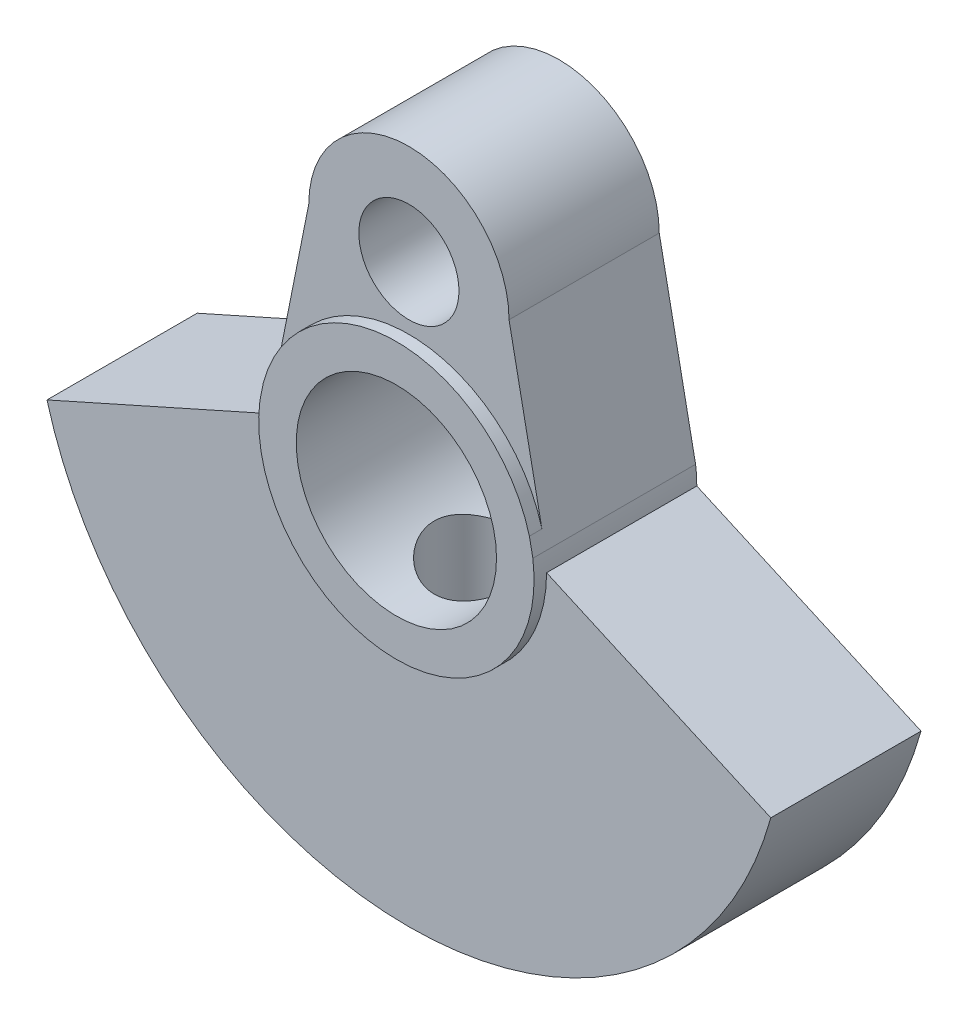
ISO-10303-21;
HEADER;
FILE_DESCRIPTION(('STEP AP214'),'2;1');
FILE_NAME('part.step','',(''),(''),'','','');
FILE_SCHEMA(('AUTOMOTIVE_DESIGN { 1 0 10303 214 1 1 1 1 }'));
ENDSEC;
DATA;
#1=APPLICATION_CONTEXT('core data for automotive mechanical design processes');
#2=APPLICATION_PROTOCOL_DEFINITION('international standard','automotive_design',2000,#1);
#3=PRODUCT_CONTEXT('',#1,'mechanical');
#4=PRODUCT('Part','Part','',(#3));
#5=PRODUCT_RELATED_PRODUCT_CATEGORY('part','',(#4));
#6=PRODUCT_DEFINITION_FORMATION('','',#4);
#7=PRODUCT_DEFINITION_CONTEXT('part definition',#1,'design');
#8=PRODUCT_DEFINITION('design','',#6,#7);
#9=PRODUCT_DEFINITION_SHAPE('','',#8);
#10=(LENGTH_UNIT() NAMED_UNIT(*) SI_UNIT(.MILLI.,.METRE.));
#11=(NAMED_UNIT(*) PLANE_ANGLE_UNIT() SI_UNIT($,.RADIAN.));
#12=(NAMED_UNIT(*) SI_UNIT($,.STERADIAN.) SOLID_ANGLE_UNIT());
#13=UNCERTAINTY_MEASURE_WITH_UNIT(LENGTH_MEASURE(1.E-05),#10,'distance_accuracy_value','');
#14=(GEOMETRIC_REPRESENTATION_CONTEXT(3) GLOBAL_UNCERTAINTY_ASSIGNED_CONTEXT((#13)) GLOBAL_UNIT_ASSIGNED_CONTEXT((#10,
#11,#12)) REPRESENTATION_CONTEXT('',''));
#15=CARTESIAN_POINT('',(0.,0.,0.));
#16=DIRECTION('',(0.,0.,1.));
#17=DIRECTION('',(1.,0.,0.));
#18=AXIS2_PLACEMENT_3D('',#15,#16,#17);
#19=CARTESIAN_POINT('',(-5.38239879261477,1.07435846219703,3.));
#20=DIRECTION('',(0.980654930855413,-0.195744493125514,0.));
#21=DIRECTION('',(0.195744493125514,0.980654930855413,0.));
#22=AXIS2_PLACEMENT_3D('',#19,#20,#21);
#23=PLANE('',#22);
#24=DIRECTION('',(-0.195744493125514,-0.980654930855414,0.));
#25=VECTOR('',#24,1.);
#26=CARTESIAN_POINT('',(-5.38239879261477,1.07435846219703,-3.));
#27=LINE('',#26,#25);
#28=CARTESIAN_POINT('',(-4.,8.,-3.));
#29=VERTEX_POINT('',#28);
#30=CARTESIAN_POINT('',(-5.45175345375449,0.726900460500602,-3.));
#31=VERTEX_POINT('',#30);
#32=EDGE_CURVE('E242',#29,#31,#27,.T.);
#33=ORIENTED_EDGE('',*,*,#32,.T.);
#34=DIRECTION('',(0.,0.,-1.));
#35=VECTOR('',#34,1.);
#36=CARTESIAN_POINT('',(-5.45175345375449,0.726900460500602,3.5));
#37=LINE('',#36,#35);
#38=CARTESIAN_POINT('',(-5.45175345375449,0.726900460500602,3.5));
#39=VERTEX_POINT('',#38);
#40=EDGE_CURVE('E213',#39,#31,#37,.T.);
#41=ORIENTED_EDGE('',*,*,#40,.F.);
#42=DIRECTION('',(-0.195744493125514,-0.980654930855414,0.));
#43=VECTOR('',#42,1.);
#44=CARTESIAN_POINT('',(-5.38239879261477,1.07435846219703,3.5));
#45=LINE('',#44,#43);
#46=CARTESIAN_POINT('',(-5.31304413147506,1.42181646389345,3.5));
#47=VERTEX_POINT('',#46);
#48=EDGE_CURVE('E196',#47,#39,#45,.T.);
#49=ORIENTED_EDGE('',*,*,#48,.F.);
#50=DIRECTION('',(0.,0.,-1.));
#51=VECTOR('',#50,1.);
#52=CARTESIAN_POINT('',(-5.31304413147506,1.42181646389345,3.5));
#53=LINE('',#52,#51);
#54=CARTESIAN_POINT('',(-5.31304413147506,1.42181646389345,3.));
#55=VERTEX_POINT('',#54);
#56=EDGE_CURVE('E209',#47,#55,#53,.T.);
#57=ORIENTED_EDGE('',*,*,#56,.T.);
#58=DIRECTION('',(-0.195744493125514,-0.980654930855414,0.));
#59=VECTOR('',#58,1.);
#60=CARTESIAN_POINT('',(-5.38239879261477,1.07435846219703,3.));
#61=LINE('',#60,#59);
#62=CARTESIAN_POINT('',(-4.,8.,3.));
#63=VERTEX_POINT('',#62);
#64=EDGE_CURVE('E224',#63,#55,#61,.T.);
#65=ORIENTED_EDGE('',*,*,#64,.F.);
#66=DIRECTION('',(0.,0.,-1.));
#67=VECTOR('',#66,1.);
#68=CARTESIAN_POINT('',(-4.,8.,3.));
#69=LINE('',#68,#67);
#70=EDGE_CURVE('E65',#63,#29,#69,.T.);
#71=ORIENTED_EDGE('',*,*,#70,.T.);
#72=EDGE_LOOP('',(#33,#41,#49,#57,#65,#71));
#73=FACE_BOUND('',#72,.T.);
#74=ADVANCED_FACE('F56',(#73),#23,.F.);
#75=CARTESIAN_POINT('',(5.38239879261477,1.07435846219703,3.));
#76=DIRECTION('',(0.980654930855413,0.195744493125514,0.));
#77=DIRECTION('',(-0.195744493125514,0.980654930855413,0.));
#78=AXIS2_PLACEMENT_3D('',#75,#76,#77);
#79=PLANE('',#78);
#80=DIRECTION('',(0.195744493125514,-0.980654930855414,0.));
#81=VECTOR('',#80,1.);
#82=CARTESIAN_POINT('',(5.38239879261477,1.07435846219703,-3.));
#83=LINE('',#82,#81);
#84=CARTESIAN_POINT('',(4.,8.,-3.));
#85=VERTEX_POINT('',#84);
#86=CARTESIAN_POINT('',(5.45175345375449,0.726900460500602,-3.));
#87=VERTEX_POINT('',#86);
#88=EDGE_CURVE('E245',#85,#87,#83,.T.);
#89=ORIENTED_EDGE('',*,*,#88,.F.);
#90=DIRECTION('',(0.,0.,-1.));
#91=VECTOR('',#90,1.);
#92=CARTESIAN_POINT('',(4.,8.,3.));
#93=LINE('',#92,#91);
#94=CARTESIAN_POINT('',(4.,8.,3.));
#95=VERTEX_POINT('',#94);
#96=EDGE_CURVE('E12',#95,#85,#93,.T.);
#97=ORIENTED_EDGE('',*,*,#96,.F.);
#98=DIRECTION('',(0.195744493125514,-0.980654930855414,0.));
#99=VECTOR('',#98,1.);
#100=CARTESIAN_POINT('',(5.38239879261477,1.07435846219703,3.));
#101=LINE('',#100,#99);
#102=CARTESIAN_POINT('',(5.31304413147506,1.42181646389345,3.));
#103=VERTEX_POINT('',#102);
#104=EDGE_CURVE('E232',#95,#103,#101,.T.);
#105=ORIENTED_EDGE('',*,*,#104,.T.);
#106=DIRECTION('',(0.,0.,-1.));
#107=VECTOR('',#106,1.);
#108=CARTESIAN_POINT('',(5.31304413147506,1.42181646389345,3.5));
#109=LINE('',#108,#107);
#110=CARTESIAN_POINT('',(5.31304413147506,1.42181646389345,3.5));
#111=VERTEX_POINT('',#110);
#112=EDGE_CURVE('E205',#111,#103,#109,.T.);
#113=ORIENTED_EDGE('',*,*,#112,.F.);
#114=DIRECTION('',(0.195744493125514,-0.980654930855414,0.));
#115=VECTOR('',#114,1.);
#116=CARTESIAN_POINT('',(5.38239879261477,1.07435846219703,3.5));
#117=LINE('',#116,#115);
#118=CARTESIAN_POINT('',(5.45175345375449,0.726900460500602,3.5));
#119=VERTEX_POINT('',#118);
#120=EDGE_CURVE('E188',#111,#119,#117,.T.);
#121=ORIENTED_EDGE('',*,*,#120,.T.);
#122=DIRECTION('',(0.,0.,-1.));
#123=VECTOR('',#122,1.);
#124=CARTESIAN_POINT('',(5.45175345375449,0.726900460500602,3.5));
#125=LINE('',#124,#123);
#126=EDGE_CURVE('E202',#119,#87,#125,.T.);
#127=ORIENTED_EDGE('',*,*,#126,.T.);
#128=EDGE_LOOP('',(#89,#97,#105,#113,#121,#127));
#129=FACE_BOUND('',#128,.T.);
#130=ADVANCED_FACE('F282',(#129),#79,.T.);
#131=CARTESIAN_POINT('',(0.,8.,3.));
#132=DIRECTION('',(0.,0.,-1.));
#133=DIRECTION('',(-1.,0.,0.));
#134=AXIS2_PLACEMENT_3D('',#131,#132,#133);
#135=CYLINDRICAL_SURFACE('',#134,2.);
#136=CARTESIAN_POINT('',(0.,8.,3.));
#137=DIRECTION('',(0.,0.,1.));
#138=DIRECTION('',(1.,0.,0.));
#139=AXIS2_PLACEMENT_3D('',#136,#137,#138);
#140=CIRCLE('',#139,2.);
#141=CARTESIAN_POINT('',(2.,8.,3.));
#142=VERTEX_POINT('',#141);
#143=EDGE_CURVE('E220',#142,#142,#140,.T.);
#144=ORIENTED_EDGE('',*,*,#143,.T.);
#145=EDGE_LOOP('',(#144));
#146=FACE_BOUND('',#145,.T.);
#147=CARTESIAN_POINT('',(0.,8.,-3.));
#148=DIRECTION('',(0.,0.,1.));
#149=DIRECTION('',(1.,0.,0.));
#150=AXIS2_PLACEMENT_3D('',#147,#148,#149);
#151=CIRCLE('',#150,2.);
#152=CARTESIAN_POINT('',(2.,8.,-3.));
#153=VERTEX_POINT('',#152);
#154=EDGE_CURVE('E208',#153,#153,#151,.T.);
#155=ORIENTED_EDGE('',*,*,#154,.F.);
#156=EDGE_LOOP('',(#155));
#157=FACE_BOUND('',#156,.T.);
#158=ADVANCED_FACE('F58',(#146,#157),#135,.F.);
#159=CARTESIAN_POINT('',(0.,8.,3.));
#160=DIRECTION('',(0.,0.,-1.));
#161=DIRECTION('',(-1.,0.,0.));
#162=AXIS2_PLACEMENT_3D('',#159,#160,#161);
#163=CYLINDRICAL_SURFACE('',#162,4.);
#164=CARTESIAN_POINT('',(0.,8.,-3.));
#165=DIRECTION('',(0.,0.,1.));
#166=DIRECTION('',(1.,0.,0.));
#167=AXIS2_PLACEMENT_3D('',#164,#165,#166);
#168=CIRCLE('',#167,4.);
#169=EDGE_CURVE('E225',#85,#29,#168,.T.);
#170=ORIENTED_EDGE('',*,*,#169,.T.);
#171=ORIENTED_EDGE('',*,*,#70,.F.);
#172=CARTESIAN_POINT('',(0.,8.,3.));
#173=DIRECTION('',(0.,0.,1.));
#174=DIRECTION('',(1.,0.,0.));
#175=AXIS2_PLACEMENT_3D('',#172,#173,#174);
#176=CIRCLE('',#175,4.);
#177=EDGE_CURVE('E236',#95,#63,#176,.T.);
#178=ORIENTED_EDGE('',*,*,#177,.F.);
#179=ORIENTED_EDGE('',*,*,#96,.T.);
#180=EDGE_LOOP('',(#170,#171,#178,#179));
#181=FACE_BOUND('',#180,.T.);
#182=ADVANCED_FACE('F283',(#181),#163,.T.);
#183=CARTESIAN_POINT('',(0.,0.,3.));
#184=DIRECTION('',(0.,0.,1.));
#185=DIRECTION('',(1.,0.,0.));
#186=AXIS2_PLACEMENT_3D('',#183,#184,#185);
#187=PLANE('',#186);
#188=ORIENTED_EDGE('',*,*,#143,.F.);
#189=EDGE_LOOP('',(#188));
#190=FACE_BOUND('',#189,.T.);
#191=ORIENTED_EDGE('',*,*,#64,.T.);
#192=CARTESIAN_POINT('',(0.,0.,3.));
#193=DIRECTION('',(0.,0.,1.));
#194=DIRECTION('',(1.,0.,0.));
#195=AXIS2_PLACEMENT_3D('',#192,#193,#194);
#196=CIRCLE('',#195,5.5);
#197=EDGE_CURVE('E229',#103,#55,#196,.T.);
#198=ORIENTED_EDGE('',*,*,#197,.F.);
#199=ORIENTED_EDGE('',*,*,#104,.F.);
#200=ORIENTED_EDGE('',*,*,#177,.T.);
#201=EDGE_LOOP('',(#191,#198,#199,#200));
#202=FACE_BOUND('',#201,.T.);
#203=ADVANCED_FACE('F280',(#190,#202),#187,.T.);
#204=CARTESIAN_POINT('',(0.,0.,-3.));
#205=DIRECTION('',(0.,0.,1.));
#206=DIRECTION('',(1.,0.,0.));
#207=AXIS2_PLACEMENT_3D('',#204,#205,#206);
#208=PLANE('',#207);
#209=ORIENTED_EDGE('',*,*,#154,.T.);
#210=EDGE_LOOP('',(#209));
#211=FACE_BOUND('',#210,.T.);
#212=ORIENTED_EDGE('',*,*,#32,.F.);
#213=ORIENTED_EDGE('',*,*,#169,.F.);
#214=ORIENTED_EDGE('',*,*,#88,.T.);
#215=CARTESIAN_POINT('',(0.,0.,-3.));
#216=DIRECTION('',(0.,0.,1.));
#217=DIRECTION('',(1.,0.,0.));
#218=AXIS2_PLACEMENT_3D('',#215,#216,#217);
#219=CIRCLE('',#218,5.5);
#220=CARTESIAN_POINT('',(5.5,0.,-3.));
#221=VERTEX_POINT('',#220);
#222=EDGE_CURVE('E184',#221,#87,#219,.T.);
#223=ORIENTED_EDGE('',*,*,#222,.F.);
#224=DIRECTION('',(-0.9130842111692,0.407771042759929,0.));
#225=VECTOR('',#224,1.);
#226=CARTESIAN_POINT('',(0.914524728224361,2.04781115503851,-3.));
#227=LINE('',#226,#225);
#228=CARTESIAN_POINT('',(14.456832294801,-4.,-3.));
#229=VERTEX_POINT('',#228);
#230=EDGE_CURVE('E157',#229,#221,#227,.T.);
#231=ORIENTED_EDGE('',*,*,#230,.F.);
#232=CARTESIAN_POINT('',(0.,0.,-3.));
#233=DIRECTION('',(0.,0.,1.));
#234=DIRECTION('',(1.,0.,0.));
#235=AXIS2_PLACEMENT_3D('',#232,#233,#234);
#236=CIRCLE('',#235,15.);
#237=CARTESIAN_POINT('',(-14.456832294801,-4.,-3.));
#238=VERTEX_POINT('',#237);
#239=EDGE_CURVE('E166',#238,#229,#236,.T.);
#240=ORIENTED_EDGE('',*,*,#239,.F.);
#241=DIRECTION('',(0.9130842111692,0.407771042759929,0.));
#242=VECTOR('',#241,1.);
#243=CARTESIAN_POINT('',(-0.914524728224361,2.04781115503851,-3.));
#244=LINE('',#243,#242);
#245=CARTESIAN_POINT('',(-5.5,0.,-3.));
#246=VERTEX_POINT('',#245);
#247=EDGE_CURVE('E138',#238,#246,#244,.T.);
#248=ORIENTED_EDGE('',*,*,#247,.T.);
#249=EDGE_CURVE('E193',#31,#246,#219,.T.);
#250=ORIENTED_EDGE('',*,*,#249,.F.);
#251=EDGE_LOOP('',(#212,#213,#214,#223,#231,#240,#248,#250));
#252=FACE_BOUND('',#251,.T.);
#253=CARTESIAN_POINT('',(0.,0.,-3.));
#254=DIRECTION('',(0.,0.,1.));
#255=DIRECTION('',(1.,0.,0.));
#256=AXIS2_PLACEMENT_3D('',#253,#254,#255);
#257=CIRCLE('',#256,4.);
#258=CARTESIAN_POINT('',(4.,0.,-3.));
#259=VERTEX_POINT('',#258);
#260=EDGE_CURVE('E179',#259,#259,#257,.T.);
#261=ORIENTED_EDGE('',*,*,#260,.T.);
#262=EDGE_LOOP('',(#261));
#263=FACE_BOUND('',#262,.T.);
#264=ADVANCED_FACE('F262',(#211,#252,#263),#208,.F.);
#265=CARTESIAN_POINT('',(0.,0.,3.5));
#266=DIRECTION('',(0.,0.,1.));
#267=DIRECTION('',(1.,0.,0.));
#268=AXIS2_PLACEMENT_3D('',#265,#266,#267);
#269=PLANE('',#268);
#270=ORIENTED_EDGE('',*,*,#120,.F.);
#271=CARTESIAN_POINT('',(0.,0.,3.5));
#272=DIRECTION('',(0.,0.,1.));
#273=DIRECTION('',(1.,0.,0.));
#274=AXIS2_PLACEMENT_3D('',#271,#272,#273);
#275=CIRCLE('',#274,5.5);
#276=EDGE_CURVE('E199',#111,#47,#275,.T.);
#277=ORIENTED_EDGE('',*,*,#276,.T.);
#278=ORIENTED_EDGE('',*,*,#48,.T.);
#279=CARTESIAN_POINT('',(0.,0.,3.5));
#280=DIRECTION('',(0.,0.,1.));
#281=DIRECTION('',(1.,0.,0.));
#282=AXIS2_PLACEMENT_3D('',#279,#280,#281);
#283=CIRCLE('',#282,5.5);
#284=EDGE_CURVE('E192',#39,#119,#283,.T.);
#285=ORIENTED_EDGE('',*,*,#284,.T.);
#286=EDGE_LOOP('',(#270,#277,#278,#285));
#287=FACE_BOUND('',#286,.T.);
#288=CARTESIAN_POINT('',(0.,0.,3.5));
#289=DIRECTION('',(0.,0.,1.));
#290=DIRECTION('',(1.,0.,0.));
#291=AXIS2_PLACEMENT_3D('',#288,#289,#290);
#292=CIRCLE('',#291,4.);
#293=CARTESIAN_POINT('',(4.,0.,3.5));
#294=VERTEX_POINT('',#293);
#295=EDGE_CURVE('E180',#294,#294,#292,.T.);
#296=ORIENTED_EDGE('',*,*,#295,.F.);
#297=EDGE_LOOP('',(#296));
#298=FACE_BOUND('',#297,.T.);
#299=ADVANCED_FACE('F272',(#287,#298),#269,.T.);
#300=CARTESIAN_POINT('',(0.,0.,3.5));
#301=DIRECTION('',(0.,0.,-1.));
#302=DIRECTION('',(-1.,0.,0.));
#303=AXIS2_PLACEMENT_3D('',#300,#301,#302);
#304=CYLINDRICAL_SURFACE('',#303,5.5);
#305=ORIENTED_EDGE('',*,*,#197,.T.);
#306=ORIENTED_EDGE('',*,*,#56,.F.);
#307=ORIENTED_EDGE('',*,*,#276,.F.);
#308=ORIENTED_EDGE('',*,*,#112,.T.);
#309=EDGE_LOOP('',(#305,#306,#307,#308));
#310=FACE_BOUND('',#309,.T.);
#311=ADVANCED_FACE('F276',(#310),#304,.T.);
#312=CARTESIAN_POINT('',(0.,0.,3.5));
#313=DIRECTION('',(0.,0.,-1.));
#314=DIRECTION('',(-1.,0.,0.));
#315=AXIS2_PLACEMENT_3D('',#312,#313,#314);
#316=CYLINDRICAL_SURFACE('',#315,5.5);
#317=ORIENTED_EDGE('',*,*,#249,.T.);
#318=DIRECTION('',(0.,0.,-1.));
#319=VECTOR('',#318,1.);
#320=CARTESIAN_POINT('',(-5.5,0.,3.));
#321=LINE('',#320,#319);
#322=CARTESIAN_POINT('',(-5.5,0.,3.));
#323=VERTEX_POINT('',#322);
#324=EDGE_CURVE('E77',#323,#246,#321,.T.);
#325=ORIENTED_EDGE('',*,*,#324,.F.);
#326=CARTESIAN_POINT('',(0.,0.,3.));
#327=DIRECTION('',(0.,0.,1.));
#328=DIRECTION('',(1.,0.,0.));
#329=AXIS2_PLACEMENT_3D('',#326,#327,#328);
#330=CIRCLE('',#329,5.5);
#331=CARTESIAN_POINT('',(5.5,0.,3.));
#332=VERTEX_POINT('',#331);
#333=EDGE_CURVE('E72',#323,#332,#330,.T.);
#334=ORIENTED_EDGE('',*,*,#333,.T.);
#335=DIRECTION('',(0.,0.,-1.));
#336=VECTOR('',#335,1.);
#337=CARTESIAN_POINT('',(5.5,0.,3.));
#338=LINE('',#337,#336);
#339=EDGE_CURVE('E163',#332,#221,#338,.T.);
#340=ORIENTED_EDGE('',*,*,#339,.T.);
#341=ORIENTED_EDGE('',*,*,#222,.T.);
#342=ORIENTED_EDGE('',*,*,#126,.F.);
#343=ORIENTED_EDGE('',*,*,#284,.F.);
#344=ORIENTED_EDGE('',*,*,#40,.T.);
#345=EDGE_LOOP('',(#317,#325,#334,#340,#341,#342,#343,#344));
#346=FACE_BOUND('',#345,.T.);
#347=ADVANCED_FACE('F265',(#346),#316,.T.);
#348=CARTESIAN_POINT('',(0.,0.,3.5));
#349=DIRECTION('',(0.,0.,-1.));
#350=DIRECTION('',(-1.,0.,0.));
#351=AXIS2_PLACEMENT_3D('',#348,#349,#350);
#352=CYLINDRICAL_SURFACE('',#351,4.);
#353=CARTESIAN_POINT('',(0.,-4.,-2.01606330910532));
#354=CARTESIAN_POINT('',(-0.105143925902467,-3.99999426810082,-2.01605670447093));
#355=CARTESIAN_POINT('',(-0.210413199395125,-3.99580982039513,-2.00772316286321));
#356=CARTESIAN_POINT('',(-0.417840470537792,-3.97948312074314,-1.97475754842224));
#357=CARTESIAN_POINT('',(-0.519992173427259,-3.96732575657839,-1.95009452310969));
#358=CARTESIAN_POINT('',(-0.717867089760897,-3.93632558806751,-1.88567569187206));
#359=CARTESIAN_POINT('',(-0.813613605878292,-3.91750878355075,-1.84597854060938));
#360=CARTESIAN_POINT('',(-0.996945233613196,-3.87491553031523,-1.75292206637535));
#361=CARTESIAN_POINT('',(-1.08453098798012,-3.85113947267051,-1.69956382060759));
#362=CARTESIAN_POINT('',(-1.25501563552382,-3.79912516516124,-1.57702881013475));
#363=CARTESIAN_POINT('',(-1.33731042224422,-3.77070398255074,-1.50709035062604));
#364=CARTESIAN_POINT('',(-1.48955888973396,-3.71319940493486,-1.35502035061124));
#365=CARTESIAN_POINT('',(-1.55950316621353,-3.68411552418069,-1.27287960556044));
#366=CARTESIAN_POINT('',(-1.69050400090055,-3.62597902394695,-1.09109661005856));
#367=CARTESIAN_POINT('',(-1.75045067110327,-3.59710373940264,-0.990591112413493));
#368=CARTESIAN_POINT('',(-1.85233645378139,-3.54571957544641,-0.779328637132889));
#369=CARTESIAN_POINT('',(-1.89428842993267,-3.52320615213979,-0.66857905165982));
#370=CARTESIAN_POINT('',(-1.95626488437717,-3.48915734075617,-0.446733098261474));
#371=CARTESIAN_POINT('',(-1.97745171416088,-3.47704543167427,-0.336054404970531));
#372=CARTESIAN_POINT('',(-2.00085398661769,-3.46363779897056,-0.112105633546366));
#373=CARTESIAN_POINT('',(-2.00308817674615,-3.46233138686576,0.00116177263698988));
#374=CARTESIAN_POINT('',(-1.98937457434459,-3.47021860514497,0.212508739525417));
#375=CARTESIAN_POINT('',(-1.97556911907364,-3.47817527324027,0.310784753340781));
#376=CARTESIAN_POINT('',(-1.93387969811386,-3.50152457467701,0.503380509640764));
#377=CARTESIAN_POINT('',(-1.9059912477953,-3.51691957663553,0.597698981505311));
#378=CARTESIAN_POINT('',(-1.836419560772,-3.55374952825482,0.782394956025998));
#379=CARTESIAN_POINT('',(-1.79443013423199,-3.57531681327997,0.872629488466257));
#380=CARTESIAN_POINT('',(-1.698083375336,-3.62206808562807,1.0452052760747));
#381=CARTESIAN_POINT('',(-1.64372048762493,-3.64725369560381,1.12754296209486));
#382=CARTESIAN_POINT('',(-1.51613210982557,-3.70226315806572,1.29297919638113));
#383=CARTESIAN_POINT('',(-1.44138891673856,-3.73227020473492,1.37485043804699));
#384=CARTESIAN_POINT('',(-1.27911115748274,-3.79095246600815,1.52540752807648));
#385=CARTESIAN_POINT('',(-1.19157051314857,-3.81962703917602,1.59408707496244));
#386=CARTESIAN_POINT('',(-1.00103301166369,-3.87403974565928,1.71930801295413));
#387=CARTESIAN_POINT('',(-0.897507183198815,-3.89957968324015,1.77513763578616));
#388=CARTESIAN_POINT('',(-0.680932430977591,-3.94315762242485,1.8681307489807));
#389=CARTESIAN_POINT('',(-0.567891152530549,-3.96120157887106,1.90530906092501));
#390=CARTESIAN_POINT('',(-0.345532983321402,-3.98648667482871,1.95688749832803));
#391=CARTESIAN_POINT('',(-0.23668306109665,-3.9944987660262,1.97291916238824));
#392=CARTESIAN_POINT('',(-0.0175591998987019,-4.00146026918207,1.98686615316365));
#393=CARTESIAN_POINT('',(0.0927140397398185,-4.00041397442637,1.98479006217361));
#394=CARTESIAN_POINT('',(0.302465943971975,-3.9898238450687,1.96352331405719));
#395=CARTESIAN_POINT('',(0.402118816099861,-3.98094491376337,1.94567162543469));
#396=CARTESIAN_POINT('',(0.596813784603882,-3.9564434262968,1.89546054710443));
#397=CARTESIAN_POINT('',(0.691855371382174,-3.94082012668824,1.86309955798769));
#398=CARTESIAN_POINT('',(0.877777216899145,-3.90368502827176,1.78393975802861));
#399=CARTESIAN_POINT('',(0.968460794011606,-3.88201763539261,1.7367545906621));
#400=CARTESIAN_POINT('',(1.14092272339854,-3.83487948634835,1.62972161960154));
#401=CARTESIAN_POINT('',(1.22269725955318,-3.80940711133877,1.56986842170389));
#402=CARTESIAN_POINT('',(1.38353537857843,-3.75416442672396,1.43241584023324));
#403=CARTESIAN_POINT('',(1.46154415563805,-3.72421769686998,1.35365095400438));
#404=CARTESIAN_POINT('',(1.60371264223771,-3.6652478321764,1.18408638833922));
#405=CARTESIAN_POINT('',(1.66786277142374,-3.63622534800094,1.09327845319884));
#406=CARTESIAN_POINT('',(1.78341582895803,-3.58102384412979,0.896649382548726));
#407=CARTESIAN_POINT('',(1.83405099160049,-3.55505059178121,0.790314158705714));
#408=CARTESIAN_POINT('',(1.91616565186941,-3.5114814458827,0.568916555744745));
#409=CARTESIAN_POINT('',(1.94766983173403,-3.493874764435,0.453865637960897));
#410=CARTESIAN_POINT('',(1.98772337493374,-3.47123002051604,0.230116245125269));
#411=CARTESIAN_POINT('',(1.9981859928109,-3.4651476693013,0.121868184024194));
#412=CARTESIAN_POINT('',(2.0013783087524,-3.46330709283207,-0.0949574434343723));
#413=CARTESIAN_POINT('',(1.99411569324648,-3.4675443925278,-0.203534846581045));
#414=CARTESIAN_POINT('',(1.96385225118662,-3.48475724102153,-0.407030312172196));
#415=CARTESIAN_POINT('',(1.94241662868606,-3.49686188965317,-0.502264249394801));
#416=CARTESIAN_POINT('',(1.88635071644882,-3.52742032375305,-0.687679547954055));
#417=CARTESIAN_POINT('',(1.85171618231984,-3.54587615139337,-0.777859273289385));
#418=CARTESIAN_POINT('',(1.76763149060113,-3.58857060729072,-0.957313011078395));
#419=CARTESIAN_POINT('',(1.7173422756314,-3.61311444791841,-1.04611911276338));
#420=CARTESIAN_POINT('',(1.60430194327478,-3.66470663269721,-1.21461238146784));
#421=CARTESIAN_POINT('',(1.54154434248312,-3.69175627591222,-1.29429477014754));
#422=CARTESIAN_POINT('',(1.39640665332274,-3.74924646316184,-1.45234727381467));
#423=CARTESIAN_POINT('',(1.31256884599452,-3.77969966613256,-1.5293815138059));
#424=CARTESIAN_POINT('',(1.13230961246639,-3.83755504519862,-1.66858927597586));
#425=CARTESIAN_POINT('',(1.03588144661039,-3.8649555725239,-1.73075478804513));
#426=CARTESIAN_POINT('',(0.831863193565888,-3.91396019133075,-1.83853603452946));
#427=CARTESIAN_POINT('',(0.724199007553458,-3.93552192987866,-1.88403164757825));
#428=CARTESIAN_POINT('',(0.50148420227617,-3.97002682597974,-1.95567964462014));
#429=CARTESIAN_POINT('',(0.386455599178197,-3.98299446726136,-1.98188700271674));
#430=CARTESIAN_POINT('',(0.225203892981788,-3.99390923826956,-2.0038581312768));
#431=CARTESIAN_POINT('',(0.180323758883128,-3.99618730680502,-2.008428590838));
#432=CARTESIAN_POINT('',(0.0903034636101824,-3.99923393953631,-2.01453264013349));
#433=CARTESIAN_POINT('',(0.0451632952932565,-4.00000246206761,-2.01606614604573));
#434=CARTESIAN_POINT('',(0.,-4.,-2.01606330910532));
#435=B_SPLINE_CURVE_WITH_KNOTS('',3,(#353,#354,#355,#356,#357,#358,#359,#360,#361,#362,#363,
#364,#365,#366,#367,#368,#369,#370,#371,#372,#373,#374,#375,#376,#377,#378,#379,#380,#381,#382,
#383,#384,#385,#386,#387,#388,#389,#390,#391,#392,#393,#394,#395,#396,#397,#398,#399,#400,#401,
#402,#403,#404,#405,#406,#407,#408,#409,#410,#411,#412,#413,#414,#415,#416,#417,#418,#419,#420,
#421,#422,#423,#424,#425,#426,#427,#428,#429,#430,#431,#432,#433,#434),.UNSPECIFIED.,.T.,.F.,(4,
2,2,2,2,2,2,2,2,2,2,2,2,2,2,2,2,2,2,2,2,2,2,2,2,2,2,2,2,2,2,2,2,2,2,2,2,2,2,2,4),(0.,
0.315248514840585,0.631096299418395,0.945724310984596,1.26032752116313,1.59396351743618,
1.92785247530807,2.28763452861505,2.64715895796562,2.98516024280459,3.3228271465804,
3.62011424818641,3.91749607851356,4.22180480336974,4.52625042520443,4.86929882667756,
5.21251069197372,5.57166044428881,5.93052433824558,6.2596658094269,6.58865129022951,
6.89213813012243,7.19565843261862,7.50785712055796,7.82018901496677,8.16319221288837,
8.50643177230862,8.8662936432345,9.225690238909,9.55058615006092,9.87534119729355,
10.1691586049771,10.463070575767,10.7767291356057,11.0905512228726,11.4425048551434,
11.7946476676249,12.1492802732705,12.502898172423,12.6383056026783,12.7737167702213),.UNSPECIFIED.);
#436=CARTESIAN_POINT('',(0.,-4.,-2.01606330910532));
#437=VERTEX_POINT('',#436);
#438=EDGE_CURVE('E425',#437,#437,#435,.T.);
#439=ORIENTED_EDGE('',*,*,#438,.F.);
#440=EDGE_LOOP('',(#439));
#441=FACE_BOUND('',#440,.T.);
#442=ORIENTED_EDGE('',*,*,#295,.T.);
#443=EDGE_LOOP('',(#442));
#444=FACE_BOUND('',#443,.T.);
#445=ORIENTED_EDGE('',*,*,#260,.F.);
#446=EDGE_LOOP('',(#445));
#447=FACE_BOUND('',#446,.T.);
#448=ADVANCED_FACE('F365',(#441,#444,#447),#352,.F.);
#449=CARTESIAN_POINT('',(-0.914524728224361,2.04781115503851,3.));
#450=DIRECTION('',(-0.407771042759929,0.9130842111692,0.));
#451=DIRECTION('',(-0.9130842111692,-0.407771042759929,0.));
#452=AXIS2_PLACEMENT_3D('',#449,#450,#451);
#453=PLANE('',#452);
#454=ORIENTED_EDGE('',*,*,#247,.F.);
#455=DIRECTION('',(0.,0.,-1.));
#456=VECTOR('',#455,1.);
#457=CARTESIAN_POINT('',(-14.456832294801,-4.,3.));
#458=LINE('',#457,#456);
#459=CARTESIAN_POINT('',(-14.456832294801,-4.,3.));
#460=VERTEX_POINT('',#459);
#461=EDGE_CURVE('E132',#460,#238,#458,.T.);
#462=ORIENTED_EDGE('',*,*,#461,.F.);
#463=DIRECTION('',(0.9130842111692,0.407771042759929,0.));
#464=VECTOR('',#463,1.);
#465=CARTESIAN_POINT('',(-0.914524728224361,2.04781115503851,3.));
#466=LINE('',#465,#464);
#467=EDGE_CURVE('E136',#460,#323,#466,.T.);
#468=ORIENTED_EDGE('',*,*,#467,.T.);
#469=ORIENTED_EDGE('',*,*,#324,.T.);
#470=EDGE_LOOP('',(#454,#462,#468,#469));
#471=FACE_BOUND('',#470,.T.);
#472=ADVANCED_FACE('F134',(#471),#453,.T.);
#473=CARTESIAN_POINT('',(0.,0.,3.));
#474=DIRECTION('',(0.,0.,-1.));
#475=DIRECTION('',(-1.,0.,0.));
#476=AXIS2_PLACEMENT_3D('',#473,#474,#475);
#477=CYLINDRICAL_SURFACE('',#476,15.);
#478=CARTESIAN_POINT('',(0.,-15.,-2.01606330910532));
#479=CARTESIAN_POINT('',(-0.111808835669284,-14.9999983574254,-2.01605859939841));
#480=CARTESIAN_POINT('',(-0.22368597927628,-14.9987367072719,-2.00665577114285));
#481=CARTESIAN_POINT('',(-0.444322725138078,-14.993825111269,-1.96929696005576));
#482=CARTESIAN_POINT('',(-0.553079022333036,-14.9901727244172,-1.94132201420817));
#483=CARTESIAN_POINT('',(-0.764248312626983,-14.9808907984907,-1.86766159156387));
#484=CARTESIAN_POINT('',(-0.866665683058493,-14.9752626421097,-1.82198849806688));
#485=CARTESIAN_POINT('',(-1.0623638950303,-14.9626538666039,-1.71425639529904));
#486=CARTESIAN_POINT('',(-1.15564620633702,-14.9556734655857,-1.65220002793886));
#487=CARTESIAN_POINT('',(-1.33102582250468,-14.9410899478996,-1.51305004750114));
#488=CARTESIAN_POINT('',(-1.41305798549586,-14.9334835816211,-1.43587466409685));
#489=CARTESIAN_POINT('',(-1.56304735673101,-14.9185313755795,-1.26885312002866));
#490=CARTESIAN_POINT('',(-1.63100381997221,-14.9111855496234,-1.17900628910951));
#491=CARTESIAN_POINT('',(-1.75115902268907,-14.8975543544019,-0.988764186160287));
#492=CARTESIAN_POINT('',(-1.80329607482578,-14.8912731776576,-0.888329626626695));
#493=CARTESIAN_POINT('',(-1.8899384500729,-14.8805258737923,-0.680032241868533));
#494=CARTESIAN_POINT('',(-1.92444453245278,-14.8760596685121,-0.572169736752006));
#495=CARTESIAN_POINT('',(-1.97464606772174,-14.8694793656867,-0.352757498603663));
#496=CARTESIAN_POINT('',(-1.99045204228506,-14.8673514537014,-0.2412334745724));
#497=CARTESIAN_POINT('',(-2.00314680548117,-14.8656465160931,-0.017097129499366));
#498=CARTESIAN_POINT('',(-2.00003645633601,-14.866069374204,0.0955151417055765));
#499=CARTESIAN_POINT('',(-1.97507745939234,-14.8694055577299,0.317857820922611));
#500=CARTESIAN_POINT('',(-1.95335097531761,-14.8723026462234,0.427602220780384));
#501=CARTESIAN_POINT('',(-1.89196724634371,-14.8802355277475,0.641873527654768));
#502=CARTESIAN_POINT('',(-1.85230959261457,-14.8852713695413,0.746400315649691));
#503=CARTESIAN_POINT('',(-1.75605929143191,-14.8969326111103,0.947646325601876));
#504=CARTESIAN_POINT('',(-1.69941397913749,-14.903562941239,1.04434006208898));
#505=CARTESIAN_POINT('',(-1.57083393344289,-14.9176623621993,1.22689577281234));
#506=CARTESIAN_POINT('',(-1.49889840502385,-14.9251314966353,1.31275718344885));
#507=CARTESIAN_POINT('',(-1.34110490026362,-14.9401389923359,1.47191970347657));
#508=CARTESIAN_POINT('',(-1.25514170702644,-14.947677435412,1.545116533597));
#509=CARTESIAN_POINT('',(-1.07209417013341,-14.9619192381826,1.67605873582307));
#510=CARTESIAN_POINT('',(-0.975009794442367,-14.9686225954715,1.7338040634182));
#511=CARTESIAN_POINT('',(-0.772392219730468,-14.9804439374358,1.83220580858942));
#512=CARTESIAN_POINT('',(-0.666855578841228,-14.9855612720896,1.87285522194099));
#513=CARTESIAN_POINT('',(-0.450370924336247,-14.9936282590407,1.93582600986702));
#514=CARTESIAN_POINT('',(-0.339423199542255,-14.9965780268993,1.95814836153407));
#515=CARTESIAN_POINT('',(-0.116166903325642,-14.9999624137686,1.9836951236658));
#516=CARTESIAN_POINT('',(-0.00387503454704102,-15.0004159384905,1.98706309267816));
#517=CARTESIAN_POINT('',(0.219671617218719,-14.9988079153852,1.9749850267675));
#518=CARTESIAN_POINT('',(0.330926425345665,-14.996746428686,1.95953944911232));
#519=CARTESIAN_POINT('',(0.548813715572938,-14.990351753581,1.91039203751069));
#520=CARTESIAN_POINT('',(0.655462016512045,-14.9860271430292,1.87675912257253));
#521=CARTESIAN_POINT('',(0.861605098793559,-14.9755900925429,1.79226372495759));
#522=CARTESIAN_POINT('',(0.961099607015637,-14.9694775843944,1.74140058488143));
#523=CARTESIAN_POINT('',(1.15074887861608,-14.9560983737007,1.62354453531137));
#524=CARTESIAN_POINT('',(1.2408458143966,-14.9488251504572,1.55645932518134));
#525=CARTESIAN_POINT('',(1.4085529469919,-14.9339572870998,1.40819336167042));
#526=CARTESIAN_POINT('',(1.48616257662378,-14.9263626324062,1.32701196837824));
#527=CARTESIAN_POINT('',(1.62720549423098,-14.9116490247351,1.15222354825513));
#528=CARTESIAN_POINT('',(1.69054327608938,-14.904533487753,1.05853912415652));
#529=CARTESIAN_POINT('',(1.80058351078814,-14.8916413300182,0.861777280613751));
#530=CARTESIAN_POINT('',(1.84728633510346,-14.8858646793678,0.7587000709843));
#531=CARTESIAN_POINT('',(1.92257836500746,-14.8763281178008,0.546379448866984));
#532=CARTESIAN_POINT('',(1.95122028846795,-14.872562342326,0.437155005683872));
#533=CARTESIAN_POINT('',(1.98974667143959,-14.8674574869829,0.21539305876592));
#534=CARTESIAN_POINT('',(1.99963213426781,-14.8661182773134,0.102855732570243));
#535=CARTESIAN_POINT('',(2.00034485806189,-14.8660223129545,-0.12138679995883));
#536=CARTESIAN_POINT('',(1.99132219194492,-14.8672452228252,-0.233091550069564));
#537=CARTESIAN_POINT('',(1.95479376686689,-14.872091838742,-0.453381184209193));
#538=CARTESIAN_POINT('',(1.92728801483268,-14.8757155438883,-0.561966069407297));
#539=CARTESIAN_POINT('',(1.85462310332207,-14.8849489027276,-0.772906992356907));
#540=CARTESIAN_POINT('',(1.80947220819041,-14.890557626594,-0.875265920222181));
#541=CARTESIAN_POINT('',(1.70281342759737,-14.9031304571282,-1.07097919293138));
#542=CARTESIAN_POINT('',(1.64130522630428,-14.910094589966,-1.16433336386136));
#543=CARTESIAN_POINT('',(1.50312448509508,-14.9246596718306,-1.34015295903373));
#544=CARTESIAN_POINT('',(1.42634027226901,-14.9322650575408,-1.42253025686045));
#545=CARTESIAN_POINT('',(1.26002169349823,-14.9472171900166,-1.57328652546686));
#546=CARTESIAN_POINT('',(1.17048434072977,-14.9545638756898,-1.64166220785557));
#547=CARTESIAN_POINT('',(0.980752987852819,-14.9682063513753,-1.76273044757184));
#548=CARTESIAN_POINT('',(0.880514620743963,-14.9744974642689,-1.81535397566056));
#549=CARTESIAN_POINT('',(0.672592409587326,-14.9852732065897,-1.9029439076504));
#550=CARTESIAN_POINT('',(0.564916678969887,-14.9897597692431,-1.93792921773018));
#551=CARTESIAN_POINT('',(0.380588408098417,-14.9953572174327,-1.9810113154905));
#552=CARTESIAN_POINT('',(0.305091081955777,-14.9970896363507,-1.99413655262895));
#553=CARTESIAN_POINT('',(0.153073171616111,-14.9994115849077,-2.01166412327079));
#554=CARTESIAN_POINT('',(0.0765525964512399,-15.000001124628,-2.01606653371892));
#555=CARTESIAN_POINT('',(0.,-15.,-2.01606330910532));
#556=B_SPLINE_CURVE_WITH_KNOTS('',3,(#478,#479,#480,#481,#482,#483,#484,#485,#486,#487,#488,
#489,#490,#491,#492,#493,#494,#495,#496,#497,#498,#499,#500,#501,#502,#503,#504,#505,#506,#507,
#508,#509,#510,#511,#512,#513,#514,#515,#516,#517,#518,#519,#520,#521,#522,#523,#524,#525,#526,
#527,#528,#529,#530,#531,#532,#533,#534,#535,#536,#537,#538,#539,#540,#541,#542,#543,#544,#545,
#546,#547,#548,#549,#550,#551,#552,#553,#554,#555),.UNSPECIFIED.,.T.,.F.,(4,2,2,2,2,2,2,2,2,2,2,
2,2,2,2,2,2,2,2,2,2,2,2,2,2,2,2,2,2,2,2,2,2,2,2,2,2,2,4),(0.,0.335146851305743,
0.670636430885044,1.0058916928274,1.34109292564034,1.67815978443559,2.01524447904836,
2.35362721511647,2.69199537766204,3.02835355914358,3.3646964092492,3.69884885098043,
4.0330089117585,4.36821583137897,4.70344018443797,5.04130544484849,5.37917167852295,
5.71717620202538,6.05516270391742,6.3905858499206,6.72600084354477,7.06015363396462,
7.39431917503545,7.73043274769883,8.0665615825876,8.40487704535449,8.74318495273047,
9.08050074735453,9.41779849783633,9.75242927496623,10.0870599266874,10.4215340370262,
10.756014605959,11.0930366783511,11.4301378125116,11.7686952667451,12.1068890499242,
12.3363573904731,12.5658237068544),.UNSPECIFIED.);
#557=CARTESIAN_POINT('',(0.,-15.,-2.01606330910532));
#558=VERTEX_POINT('',#557);
#559=EDGE_CURVE('E167',#558,#558,#556,.T.);
#560=ORIENTED_EDGE('',*,*,#559,.T.);
#561=EDGE_LOOP('',(#560));
#562=FACE_BOUND('',#561,.T.);
#563=ORIENTED_EDGE('',*,*,#239,.T.);
#564=DIRECTION('',(0.,0.,-1.));
#565=VECTOR('',#564,1.);
#566=CARTESIAN_POINT('',(14.456832294801,-4.,3.));
#567=LINE('',#566,#565);
#568=CARTESIAN_POINT('',(14.456832294801,-4.,3.));
#569=VERTEX_POINT('',#568);
#570=EDGE_CURVE('E142',#569,#229,#567,.T.);
#571=ORIENTED_EDGE('',*,*,#570,.F.);
#572=CARTESIAN_POINT('',(0.,0.,3.));
#573=DIRECTION('',(0.,0.,1.));
#574=DIRECTION('',(1.,0.,0.));
#575=AXIS2_PLACEMENT_3D('',#572,#573,#574);
#576=CIRCLE('',#575,15.);
#577=EDGE_CURVE('E145',#460,#569,#576,.T.);
#578=ORIENTED_EDGE('',*,*,#577,.F.);
#579=ORIENTED_EDGE('',*,*,#461,.T.);
#580=EDGE_LOOP('',(#563,#571,#578,#579));
#581=FACE_BOUND('',#580,.T.);
#582=ADVANCED_FACE('F146',(#562,#581),#477,.T.);
#583=CARTESIAN_POINT('',(0.914524728224361,2.04781115503851,3.));
#584=DIRECTION('',(-0.407771042759929,-0.9130842111692,0.));
#585=DIRECTION('',(0.9130842111692,-0.407771042759929,0.));
#586=AXIS2_PLACEMENT_3D('',#583,#584,#585);
#587=PLANE('',#586);
#588=ORIENTED_EDGE('',*,*,#230,.T.);
#589=ORIENTED_EDGE('',*,*,#339,.F.);
#590=DIRECTION('',(-0.9130842111692,0.407771042759929,0.));
#591=VECTOR('',#590,1.);
#592=CARTESIAN_POINT('',(0.914524728224361,2.04781115503851,3.));
#593=LINE('',#592,#591);
#594=EDGE_CURVE('E151',#569,#332,#593,.T.);
#595=ORIENTED_EDGE('',*,*,#594,.F.);
#596=ORIENTED_EDGE('',*,*,#570,.T.);
#597=EDGE_LOOP('',(#588,#589,#595,#596));
#598=FACE_BOUND('',#597,.T.);
#599=ADVANCED_FACE('F392',(#598),#587,.F.);
#600=CARTESIAN_POINT('',(0.,0.,3.));
#601=DIRECTION('',(0.,0.,1.));
#602=DIRECTION('',(1.,0.,0.));
#603=AXIS2_PLACEMENT_3D('',#600,#601,#602);
#604=PLANE('',#603);
#605=ORIENTED_EDGE('',*,*,#333,.F.);
#606=ORIENTED_EDGE('',*,*,#467,.F.);
#607=ORIENTED_EDGE('',*,*,#577,.T.);
#608=ORIENTED_EDGE('',*,*,#594,.T.);
#609=EDGE_LOOP('',(#605,#606,#607,#608));
#610=FACE_BOUND('',#609,.T.);
#611=ADVANCED_FACE('F153',(#610),#604,.T.);
#612=CARTESIAN_POINT('',(0.,-15.,-0.0160633091053202));
#613=DIRECTION('',(0.,-1.,0.));
#614=DIRECTION('',(0.,0.,-1.));
#615=AXIS2_PLACEMENT_3D('',#612,#613,#614);
#616=CYLINDRICAL_SURFACE('',#615,2.);
#617=ORIENTED_EDGE('',*,*,#438,.T.);
#618=EDGE_LOOP('',(#617));
#619=FACE_BOUND('',#618,.T.);
#620=ORIENTED_EDGE('',*,*,#559,.F.);
#621=EDGE_LOOP('',(#620));
#622=FACE_BOUND('',#621,.T.);
#623=ADVANCED_FACE('F379',(#619,#622),#616,.F.);
#624=CLOSED_SHELL('',(#74,#130,#158,#182,#203,#264,#299,#311,#347,#448,#472,#582,#599,#611,#623));
#625=MANIFOLD_SOLID_BREP('B2',#624);
#626=ADVANCED_BREP_SHAPE_REPRESENTATION('',(#18,#625),#14);
#627=SHAPE_DEFINITION_REPRESENTATION(#9,#626);
ENDSEC;
END-ISO-10303-21;
